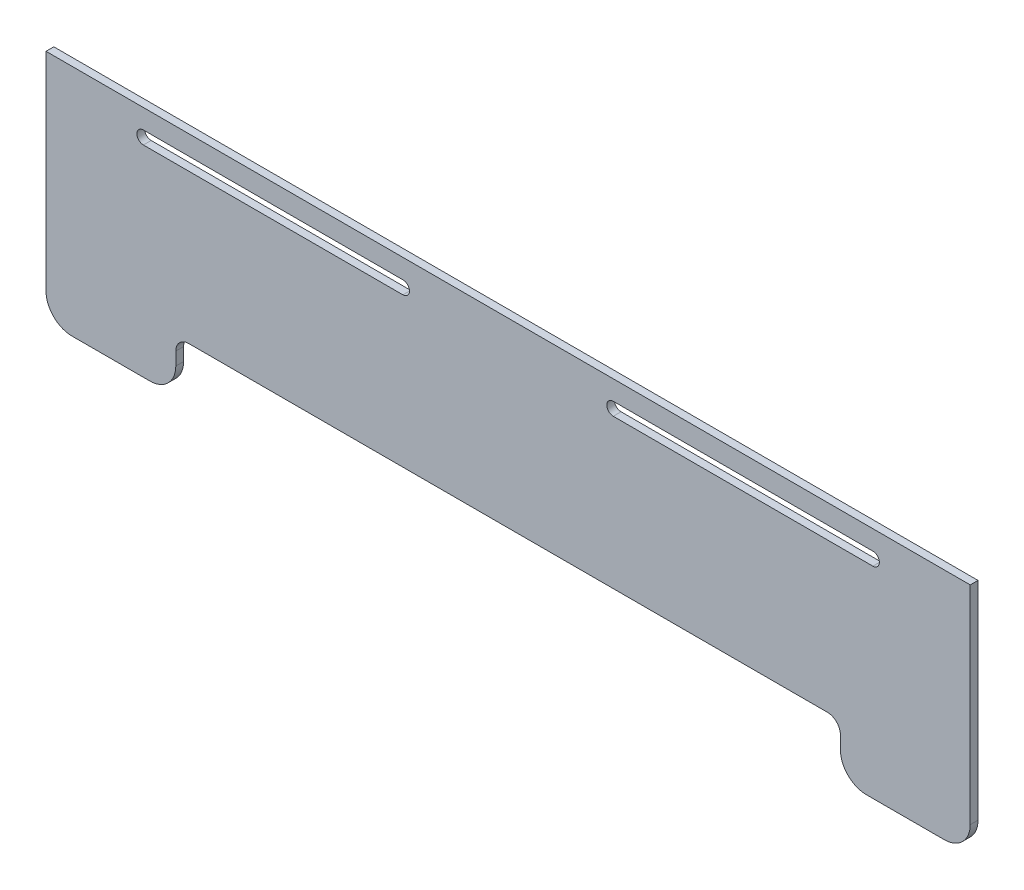
ISO-10303-21;
HEADER;
FILE_DESCRIPTION(('STEP AP214'),'2;1');
FILE_NAME('part.step','',(''),(''),'','','');
FILE_SCHEMA(('AUTOMOTIVE_DESIGN { 1 0 10303 214 1 1 1 1 }'));
ENDSEC;
DATA;
#1=APPLICATION_CONTEXT('core data for automotive mechanical design processes');
#2=APPLICATION_PROTOCOL_DEFINITION('international standard','automotive_design',2000,#1);
#3=PRODUCT_CONTEXT('',#1,'mechanical');
#4=PRODUCT('Part','Part','',(#3));
#5=PRODUCT_RELATED_PRODUCT_CATEGORY('part','',(#4));
#6=PRODUCT_DEFINITION_FORMATION('','',#4);
#7=PRODUCT_DEFINITION_CONTEXT('part definition',#1,'design');
#8=PRODUCT_DEFINITION('design','',#6,#7);
#9=PRODUCT_DEFINITION_SHAPE('','',#8);
#10=(LENGTH_UNIT() NAMED_UNIT(*) SI_UNIT(.MILLI.,.METRE.));
#11=(NAMED_UNIT(*) PLANE_ANGLE_UNIT() SI_UNIT($,.RADIAN.));
#12=(NAMED_UNIT(*) SI_UNIT($,.STERADIAN.) SOLID_ANGLE_UNIT());
#13=UNCERTAINTY_MEASURE_WITH_UNIT(LENGTH_MEASURE(1.E-05),#10,'distance_accuracy_value','');
#14=(GEOMETRIC_REPRESENTATION_CONTEXT(3) GLOBAL_UNCERTAINTY_ASSIGNED_CONTEXT((#13)) GLOBAL_UNIT_ASSIGNED_CONTEXT((#10,
#11,#12)) REPRESENTATION_CONTEXT('',''));
#15=CARTESIAN_POINT('',(0.,0.,0.));
#16=DIRECTION('',(0.,0.,1.));
#17=DIRECTION('',(1.,0.,0.));
#18=AXIS2_PLACEMENT_3D('',#15,#16,#17);
#19=CARTESIAN_POINT('',(-168.,-80.,3.));
#20=DIRECTION('',(0.,0.,-1.));
#21=DIRECTION('',(-1.,0.,0.));
#22=AXIS2_PLACEMENT_3D('',#19,#20,#21);
#23=PLANE('',#22);
#24=CARTESIAN_POINT('',(40.5,-9.99999999999983,3.));
#25=DIRECTION('',(0.,0.,1.));
#26=DIRECTION('',(1.,0.,0.));
#27=AXIS2_PLACEMENT_3D('',#24,#25,#26);
#28=CIRCLE('',#27,2.49999999999999);
#29=CARTESIAN_POINT('',(40.5,-7.50000000000004,3.));
#30=VERTEX_POINT('',#29);
#31=CARTESIAN_POINT('',(40.5,-12.5,3.));
#32=VERTEX_POINT('',#31);
#33=EDGE_CURVE('E218',#30,#32,#28,.T.);
#34=ORIENTED_EDGE('',*,*,#33,.F.);
#35=DIRECTION('',(-1.,0.,0.));
#36=VECTOR('',#35,1.);
#37=CARTESIAN_POINT('',(40.5,-7.50000000000004,3.));
#38=LINE('',#37,#36);
#39=CARTESIAN_POINT('',(140.5,-7.50000000000002,3.));
#40=VERTEX_POINT('',#39);
#41=EDGE_CURVE('E226',#40,#30,#38,.T.);
#42=ORIENTED_EDGE('',*,*,#41,.F.);
#43=CARTESIAN_POINT('',(140.5,-9.99999999999981,3.));
#44=DIRECTION('',(0.,0.,1.));
#45=DIRECTION('',(1.,0.,0.));
#46=AXIS2_PLACEMENT_3D('',#43,#44,#45);
#47=CIRCLE('',#46,2.49999999999999);
#48=CARTESIAN_POINT('',(140.5,-12.4999999999998,3.));
#49=VERTEX_POINT('',#48);
#50=EDGE_CURVE('E223',#49,#40,#47,.T.);
#51=ORIENTED_EDGE('',*,*,#50,.F.);
#52=DIRECTION('',(1.,0.,0.));
#53=VECTOR('',#52,1.);
#54=CARTESIAN_POINT('',(40.5,-12.5,3.));
#55=LINE('',#54,#53);
#56=EDGE_CURVE('E220',#32,#49,#55,.T.);
#57=ORIENTED_EDGE('',*,*,#56,.F.);
#58=EDGE_LOOP('',(#34,#42,#51,#57));
#59=FACE_BOUND('',#58,.T.);
#60=DIRECTION('',(0.,-1.,0.));
#61=VECTOR('',#60,1.);
#62=CARTESIAN_POINT('',(-178.,0.,3.));
#63=LINE('',#62,#61);
#64=CARTESIAN_POINT('',(-178.,0.,3.));
#65=VERTEX_POINT('',#64);
#66=CARTESIAN_POINT('',(-178.,-80.,3.));
#67=VERTEX_POINT('',#66);
#68=EDGE_CURVE('E249',#65,#67,#63,.T.);
#69=ORIENTED_EDGE('',*,*,#68,.T.);
#70=CARTESIAN_POINT('',(-168.,-80.,3.));
#71=DIRECTION('',(0.,0.,1.));
#72=DIRECTION('',(-1.,0.,0.));
#73=AXIS2_PLACEMENT_3D('',#70,#71,#72);
#74=CIRCLE('',#73,9.99999999999999);
#75=CARTESIAN_POINT('',(-168.,-90.,3.));
#76=VERTEX_POINT('',#75);
#77=EDGE_CURVE('E252',#67,#76,#74,.T.);
#78=ORIENTED_EDGE('',*,*,#77,.T.);
#79=DIRECTION('',(1.,0.,0.));
#80=VECTOR('',#79,1.);
#81=CARTESIAN_POINT('',(-168.,-90.,3.));
#82=LINE('',#81,#80);
#83=CARTESIAN_POINT('',(-138.,-90.0000000000001,3.));
#84=VERTEX_POINT('',#83);
#85=EDGE_CURVE('E255',#76,#84,#82,.T.);
#86=ORIENTED_EDGE('',*,*,#85,.T.);
#87=CARTESIAN_POINT('',(-138.,-80.,3.));
#88=DIRECTION('',(0.,0.,1.));
#89=DIRECTION('',(1.,0.,0.));
#90=AXIS2_PLACEMENT_3D('',#87,#88,#89);
#91=CIRCLE('',#90,10.);
#92=CARTESIAN_POINT('',(-128.,-80.,3.));
#93=VERTEX_POINT('',#92);
#94=EDGE_CURVE('E257',#84,#93,#91,.T.);
#95=ORIENTED_EDGE('',*,*,#94,.T.);
#96=DIRECTION('',(0.,1.,0.));
#97=VECTOR('',#96,1.);
#98=CARTESIAN_POINT('',(-128.,-75.,3.));
#99=LINE('',#98,#97);
#100=CARTESIAN_POINT('',(-128.,-75.,3.));
#101=VERTEX_POINT('',#100);
#102=EDGE_CURVE('E259',#93,#101,#99,.T.);
#103=ORIENTED_EDGE('',*,*,#102,.T.);
#104=CARTESIAN_POINT('',(-123.,-75.,3.));
#105=DIRECTION('',(0.,0.,-1.));
#106=DIRECTION('',(-1.,0.,0.));
#107=AXIS2_PLACEMENT_3D('',#104,#105,#106);
#108=CIRCLE('',#107,5.);
#109=CARTESIAN_POINT('',(-123.,-70.,3.));
#110=VERTEX_POINT('',#109);
#111=EDGE_CURVE('E261',#101,#110,#108,.T.);
#112=ORIENTED_EDGE('',*,*,#111,.T.);
#113=DIRECTION('',(1.,0.,0.));
#114=VECTOR('',#113,1.);
#115=CARTESIAN_POINT('',(-123.,-70.,3.));
#116=LINE('',#115,#114);
#117=CARTESIAN_POINT('',(123.,-70.,3.));
#118=VERTEX_POINT('',#117);
#119=EDGE_CURVE('E263',#110,#118,#116,.T.);
#120=ORIENTED_EDGE('',*,*,#119,.T.);
#121=CARTESIAN_POINT('',(123.,-75.,3.));
#122=DIRECTION('',(0.,0.,-1.));
#123=DIRECTION('',(1.,0.,0.));
#124=AXIS2_PLACEMENT_3D('',#121,#122,#123);
#125=CIRCLE('',#124,5.);
#126=CARTESIAN_POINT('',(128.,-75.,3.));
#127=VERTEX_POINT('',#126);
#128=EDGE_CURVE('E265',#118,#127,#125,.T.);
#129=ORIENTED_EDGE('',*,*,#128,.T.);
#130=DIRECTION('',(0.,-1.,0.));
#131=VECTOR('',#130,1.);
#132=CARTESIAN_POINT('',(128.,-75.,3.));
#133=LINE('',#132,#131);
#134=CARTESIAN_POINT('',(128.,-80.,3.));
#135=VERTEX_POINT('',#134);
#136=EDGE_CURVE('E267',#127,#135,#133,.T.);
#137=ORIENTED_EDGE('',*,*,#136,.T.);
#138=CARTESIAN_POINT('',(138.,-80.,3.));
#139=DIRECTION('',(0.,0.,1.));
#140=DIRECTION('',(-1.,0.,0.));
#141=AXIS2_PLACEMENT_3D('',#138,#139,#140);
#142=CIRCLE('',#141,10.);
#143=CARTESIAN_POINT('',(138.,-90.,3.));
#144=VERTEX_POINT('',#143);
#145=EDGE_CURVE('E269',#135,#144,#142,.T.);
#146=ORIENTED_EDGE('',*,*,#145,.T.);
#147=DIRECTION('',(1.,0.,0.));
#148=VECTOR('',#147,1.);
#149=CARTESIAN_POINT('',(168.,-90.,3.));
#150=LINE('',#149,#148);
#151=CARTESIAN_POINT('',(168.,-90.,3.));
#152=VERTEX_POINT('',#151);
#153=EDGE_CURVE('E271',#144,#152,#150,.T.);
#154=ORIENTED_EDGE('',*,*,#153,.T.);
#155=CARTESIAN_POINT('',(168.,-80.,3.));
#156=DIRECTION('',(0.,0.,1.));
#157=DIRECTION('',(-1.,0.,0.));
#158=AXIS2_PLACEMENT_3D('',#155,#156,#157);
#159=CIRCLE('',#158,10.);
#160=CARTESIAN_POINT('',(178.,-80.,3.));
#161=VERTEX_POINT('',#160);
#162=EDGE_CURVE('E273',#152,#161,#159,.T.);
#163=ORIENTED_EDGE('',*,*,#162,.T.);
#164=DIRECTION('',(0.,1.,0.));
#165=VECTOR('',#164,1.);
#166=CARTESIAN_POINT('',(178.,0.,3.));
#167=LINE('',#166,#165);
#168=CARTESIAN_POINT('',(178.,0.,3.));
#169=VERTEX_POINT('',#168);
#170=EDGE_CURVE('E275',#161,#169,#167,.T.);
#171=ORIENTED_EDGE('',*,*,#170,.T.);
#172=DIRECTION('',(-1.,0.,0.));
#173=VECTOR('',#172,1.);
#174=CARTESIAN_POINT('',(-178.,0.,3.));
#175=LINE('',#174,#173);
#176=EDGE_CURVE('E277',#169,#65,#175,.T.);
#177=ORIENTED_EDGE('',*,*,#176,.T.);
#178=EDGE_LOOP('',(#69,#78,#86,#95,#103,#112,#120,#129,#137,#146,#154,#163,#171,#177));
#179=FACE_BOUND('',#178,.T.);
#180=CARTESIAN_POINT('',(-40.5,-10.,3.));
#181=DIRECTION('',(0.,0.,1.));
#182=DIRECTION('',(-1.,0.,0.));
#183=AXIS2_PLACEMENT_3D('',#180,#181,#182);
#184=CIRCLE('',#183,2.49999999999999);
#185=CARTESIAN_POINT('',(-40.5,-12.5,3.));
#186=VERTEX_POINT('',#185);
#187=CARTESIAN_POINT('',(-40.5,-7.50000000000004,3.));
#188=VERTEX_POINT('',#187);
#189=EDGE_CURVE('E182',#186,#188,#184,.T.);
#190=ORIENTED_EDGE('',*,*,#189,.F.);
#191=DIRECTION('',(1.,0.,0.));
#192=VECTOR('',#191,1.);
#193=CARTESIAN_POINT('',(-40.5,-12.5,3.));
#194=LINE('',#193,#192);
#195=CARTESIAN_POINT('',(-140.5,-12.5,3.));
#196=VERTEX_POINT('',#195);
#197=EDGE_CURVE('E204',#196,#186,#194,.T.);
#198=ORIENTED_EDGE('',*,*,#197,.F.);
#199=CARTESIAN_POINT('',(-140.5,-9.99999999999981,3.));
#200=DIRECTION('',(0.,0.,1.));
#201=DIRECTION('',(-1.,0.,0.));
#202=AXIS2_PLACEMENT_3D('',#199,#200,#201);
#203=CIRCLE('',#202,2.49999999999999);
#204=CARTESIAN_POINT('',(-140.5,-7.50000000000002,3.));
#205=VERTEX_POINT('',#204);
#206=EDGE_CURVE('E202',#205,#196,#203,.T.);
#207=ORIENTED_EDGE('',*,*,#206,.F.);
#208=DIRECTION('',(-1.,0.,0.));
#209=VECTOR('',#208,1.);
#210=CARTESIAN_POINT('',(-40.5,-7.50000000000004,3.));
#211=LINE('',#210,#209);
#212=EDGE_CURVE('E190',#188,#205,#211,.T.);
#213=ORIENTED_EDGE('',*,*,#212,.F.);
#214=EDGE_LOOP('',(#190,#198,#207,#213));
#215=FACE_BOUND('',#214,.T.);
#216=ADVANCED_FACE('F33',(#59,#179,#215),#23,.F.);
#217=CARTESIAN_POINT('',(-168.,-80.,0.));
#218=DIRECTION('',(0.,0.,-1.));
#219=DIRECTION('',(-1.,0.,0.));
#220=AXIS2_PLACEMENT_3D('',#217,#218,#219);
#221=PLANE('',#220);
#222=DIRECTION('',(0.,-1.,0.));
#223=VECTOR('',#222,1.);
#224=CARTESIAN_POINT('',(-178.,0.,0.));
#225=LINE('',#224,#223);
#226=CARTESIAN_POINT('',(-178.,0.,0.));
#227=VERTEX_POINT('',#226);
#228=CARTESIAN_POINT('',(-178.,-80.,0.));
#229=VERTEX_POINT('',#228);
#230=EDGE_CURVE('E248',#227,#229,#225,.T.);
#231=ORIENTED_EDGE('',*,*,#230,.F.);
#232=DIRECTION('',(-1.,0.,0.));
#233=VECTOR('',#232,1.);
#234=CARTESIAN_POINT('',(-178.,0.,0.));
#235=LINE('',#234,#233);
#236=CARTESIAN_POINT('',(178.,0.,0.));
#237=VERTEX_POINT('',#236);
#238=EDGE_CURVE('E253',#237,#227,#235,.T.);
#239=ORIENTED_EDGE('',*,*,#238,.F.);
#240=DIRECTION('',(0.,1.,0.));
#241=VECTOR('',#240,1.);
#242=CARTESIAN_POINT('',(178.,0.,0.));
#243=LINE('',#242,#241);
#244=CARTESIAN_POINT('',(178.,-80.,0.));
#245=VERTEX_POINT('',#244);
#246=EDGE_CURVE('E304',#245,#237,#243,.T.);
#247=ORIENTED_EDGE('',*,*,#246,.F.);
#248=CARTESIAN_POINT('',(168.,-80.,0.));
#249=DIRECTION('',(0.,0.,1.));
#250=DIRECTION('',(-1.,0.,0.));
#251=AXIS2_PLACEMENT_3D('',#248,#249,#250);
#252=CIRCLE('',#251,10.);
#253=CARTESIAN_POINT('',(168.,-90.,0.));
#254=VERTEX_POINT('',#253);
#255=EDGE_CURVE('E302',#254,#245,#252,.T.);
#256=ORIENTED_EDGE('',*,*,#255,.F.);
#257=DIRECTION('',(1.,0.,0.));
#258=VECTOR('',#257,1.);
#259=CARTESIAN_POINT('',(168.,-90.,0.));
#260=LINE('',#259,#258);
#261=CARTESIAN_POINT('',(138.,-90.,0.));
#262=VERTEX_POINT('',#261);
#263=EDGE_CURVE('E300',#262,#254,#260,.T.);
#264=ORIENTED_EDGE('',*,*,#263,.F.);
#265=CARTESIAN_POINT('',(138.,-80.,0.));
#266=DIRECTION('',(0.,0.,1.));
#267=DIRECTION('',(-1.,0.,0.));
#268=AXIS2_PLACEMENT_3D('',#265,#266,#267);
#269=CIRCLE('',#268,10.);
#270=CARTESIAN_POINT('',(128.,-80.,0.));
#271=VERTEX_POINT('',#270);
#272=EDGE_CURVE('E298',#271,#262,#269,.T.);
#273=ORIENTED_EDGE('',*,*,#272,.F.);
#274=DIRECTION('',(0.,-1.,0.));
#275=VECTOR('',#274,1.);
#276=CARTESIAN_POINT('',(128.,-75.,0.));
#277=LINE('',#276,#275);
#278=CARTESIAN_POINT('',(128.,-75.,0.));
#279=VERTEX_POINT('',#278);
#280=EDGE_CURVE('E296',#279,#271,#277,.T.);
#281=ORIENTED_EDGE('',*,*,#280,.F.);
#282=CARTESIAN_POINT('',(123.,-75.,0.));
#283=DIRECTION('',(0.,0.,-1.));
#284=DIRECTION('',(1.,0.,0.));
#285=AXIS2_PLACEMENT_3D('',#282,#283,#284);
#286=CIRCLE('',#285,5.);
#287=CARTESIAN_POINT('',(123.,-70.,0.));
#288=VERTEX_POINT('',#287);
#289=EDGE_CURVE('E294',#288,#279,#286,.T.);
#290=ORIENTED_EDGE('',*,*,#289,.F.);
#291=DIRECTION('',(1.,0.,0.));
#292=VECTOR('',#291,1.);
#293=CARTESIAN_POINT('',(-123.,-70.,0.));
#294=LINE('',#293,#292);
#295=CARTESIAN_POINT('',(-123.,-70.,0.));
#296=VERTEX_POINT('',#295);
#297=EDGE_CURVE('E292',#296,#288,#294,.T.);
#298=ORIENTED_EDGE('',*,*,#297,.F.);
#299=CARTESIAN_POINT('',(-123.,-75.,0.));
#300=DIRECTION('',(0.,0.,-1.));
#301=DIRECTION('',(-1.,0.,0.));
#302=AXIS2_PLACEMENT_3D('',#299,#300,#301);
#303=CIRCLE('',#302,5.);
#304=CARTESIAN_POINT('',(-128.,-75.,0.));
#305=VERTEX_POINT('',#304);
#306=EDGE_CURVE('E290',#305,#296,#303,.T.);
#307=ORIENTED_EDGE('',*,*,#306,.F.);
#308=DIRECTION('',(0.,1.,0.));
#309=VECTOR('',#308,1.);
#310=CARTESIAN_POINT('',(-128.,-75.,0.));
#311=LINE('',#310,#309);
#312=CARTESIAN_POINT('',(-128.,-80.,0.));
#313=VERTEX_POINT('',#312);
#314=EDGE_CURVE('E288',#313,#305,#311,.T.);
#315=ORIENTED_EDGE('',*,*,#314,.F.);
#316=CARTESIAN_POINT('',(-138.,-80.,0.));
#317=DIRECTION('',(0.,0.,1.));
#318=DIRECTION('',(1.,0.,0.));
#319=AXIS2_PLACEMENT_3D('',#316,#317,#318);
#320=CIRCLE('',#319,10.);
#321=CARTESIAN_POINT('',(-138.,-90.0000000000001,0.));
#322=VERTEX_POINT('',#321);
#323=EDGE_CURVE('E286',#322,#313,#320,.T.);
#324=ORIENTED_EDGE('',*,*,#323,.F.);
#325=DIRECTION('',(1.,0.,0.));
#326=VECTOR('',#325,1.);
#327=CARTESIAN_POINT('',(-168.,-90.,0.));
#328=LINE('',#327,#326);
#329=CARTESIAN_POINT('',(-168.,-90.,0.));
#330=VERTEX_POINT('',#329);
#331=EDGE_CURVE('E284',#330,#322,#328,.T.);
#332=ORIENTED_EDGE('',*,*,#331,.F.);
#333=CARTESIAN_POINT('',(-168.,-80.,0.));
#334=DIRECTION('',(0.,0.,1.));
#335=DIRECTION('',(-1.,0.,0.));
#336=AXIS2_PLACEMENT_3D('',#333,#334,#335);
#337=CIRCLE('',#336,9.99999999999999);
#338=EDGE_CURVE('E282',#229,#330,#337,.T.);
#339=ORIENTED_EDGE('',*,*,#338,.F.);
#340=EDGE_LOOP('',(#231,#239,#247,#256,#264,#273,#281,#290,#298,#307,#315,#324,#332,#339));
#341=FACE_BOUND('',#340,.T.);
#342=DIRECTION('',(-1.,0.,0.));
#343=VECTOR('',#342,1.);
#344=CARTESIAN_POINT('',(40.5,-7.50000000000004,0.));
#345=LINE('',#344,#343);
#346=CARTESIAN_POINT('',(140.5,-7.50000000000002,0.));
#347=VERTEX_POINT('',#346);
#348=CARTESIAN_POINT('',(40.5,-7.50000000000004,0.));
#349=VERTEX_POINT('',#348);
#350=EDGE_CURVE('E221',#347,#349,#345,.T.);
#351=ORIENTED_EDGE('',*,*,#350,.T.);
#352=CARTESIAN_POINT('',(40.5,-9.99999999999983,0.));
#353=DIRECTION('',(0.,0.,1.));
#354=DIRECTION('',(1.,0.,0.));
#355=AXIS2_PLACEMENT_3D('',#352,#353,#354);
#356=CIRCLE('',#355,2.49999999999999);
#357=CARTESIAN_POINT('',(40.5,-12.5,0.));
#358=VERTEX_POINT('',#357);
#359=EDGE_CURVE('E198',#349,#358,#356,.T.);
#360=ORIENTED_EDGE('',*,*,#359,.T.);
#361=DIRECTION('',(1.,0.,0.));
#362=VECTOR('',#361,1.);
#363=CARTESIAN_POINT('',(40.5,-12.5,0.));
#364=LINE('',#363,#362);
#365=CARTESIAN_POINT('',(140.5,-12.4999999999998,0.));
#366=VERTEX_POINT('',#365);
#367=EDGE_CURVE('E231',#358,#366,#364,.T.);
#368=ORIENTED_EDGE('',*,*,#367,.T.);
#369=CARTESIAN_POINT('',(140.5,-9.99999999999981,0.));
#370=DIRECTION('',(0.,0.,1.));
#371=DIRECTION('',(1.,0.,0.));
#372=AXIS2_PLACEMENT_3D('',#369,#370,#371);
#373=CIRCLE('',#372,2.49999999999999);
#374=EDGE_CURVE('E234',#366,#347,#373,.T.);
#375=ORIENTED_EDGE('',*,*,#374,.T.);
#376=EDGE_LOOP('',(#351,#360,#368,#375));
#377=FACE_BOUND('',#376,.T.);
#378=DIRECTION('',(1.,0.,0.));
#379=VECTOR('',#378,1.);
#380=CARTESIAN_POINT('',(-40.5,-12.5,0.));
#381=LINE('',#380,#379);
#382=CARTESIAN_POINT('',(-140.5,-12.4999999999998,0.));
#383=VERTEX_POINT('',#382);
#384=CARTESIAN_POINT('',(-40.5,-12.5,0.));
#385=VERTEX_POINT('',#384);
#386=EDGE_CURVE('E191',#383,#385,#381,.T.);
#387=ORIENTED_EDGE('',*,*,#386,.T.);
#388=CARTESIAN_POINT('',(-40.5,-10.,0.));
#389=DIRECTION('',(0.,0.,1.));
#390=DIRECTION('',(-1.,0.,0.));
#391=AXIS2_PLACEMENT_3D('',#388,#389,#390);
#392=CIRCLE('',#391,2.49999999999999);
#393=CARTESIAN_POINT('',(-40.5,-7.50000000000004,0.));
#394=VERTEX_POINT('',#393);
#395=EDGE_CURVE('E56',#385,#394,#392,.T.);
#396=ORIENTED_EDGE('',*,*,#395,.T.);
#397=DIRECTION('',(-1.,0.,0.));
#398=VECTOR('',#397,1.);
#399=CARTESIAN_POINT('',(-40.5,-7.50000000000004,0.));
#400=LINE('',#399,#398);
#401=CARTESIAN_POINT('',(-140.5,-7.50000000000002,0.));
#402=VERTEX_POINT('',#401);
#403=EDGE_CURVE('E197',#394,#402,#400,.T.);
#404=ORIENTED_EDGE('',*,*,#403,.T.);
#405=CARTESIAN_POINT('',(-140.5,-9.99999999999981,0.));
#406=DIRECTION('',(0.,0.,1.));
#407=DIRECTION('',(-1.,0.,0.));
#408=AXIS2_PLACEMENT_3D('',#405,#406,#407);
#409=CIRCLE('',#408,2.49999999999999);
#410=EDGE_CURVE('E210',#402,#383,#409,.T.);
#411=ORIENTED_EDGE('',*,*,#410,.T.);
#412=EDGE_LOOP('',(#387,#396,#404,#411));
#413=FACE_BOUND('',#412,.T.);
#414=ADVANCED_FACE('F352',(#341,#377,#413),#221,.T.);
#415=CARTESIAN_POINT('',(-178.,0.,3.));
#416=DIRECTION('',(1.,0.,0.));
#417=DIRECTION('',(0.,0.,-1.));
#418=AXIS2_PLACEMENT_3D('',#415,#416,#417);
#419=PLANE('',#418);
#420=ORIENTED_EDGE('',*,*,#230,.T.);
#421=DIRECTION('',(0.,0.,-1.));
#422=VECTOR('',#421,1.);
#423=CARTESIAN_POINT('',(-178.,-80.,3.));
#424=LINE('',#423,#422);
#425=EDGE_CURVE('E11',#67,#229,#424,.T.);
#426=ORIENTED_EDGE('',*,*,#425,.F.);
#427=ORIENTED_EDGE('',*,*,#68,.F.);
#428=DIRECTION('',(0.,0.,-1.));
#429=VECTOR('',#428,1.);
#430=CARTESIAN_POINT('',(-178.,0.,3.));
#431=LINE('',#430,#429);
#432=EDGE_CURVE('E279',#65,#227,#431,.T.);
#433=ORIENTED_EDGE('',*,*,#432,.T.);
#434=EDGE_LOOP('',(#420,#426,#427,#433));
#435=FACE_BOUND('',#434,.T.);
#436=ADVANCED_FACE('F35',(#435),#419,.F.);
#437=CARTESIAN_POINT('',(-168.,-80.,3.));
#438=DIRECTION('',(0.,0.,-1.));
#439=DIRECTION('',(-1.,0.,0.));
#440=AXIS2_PLACEMENT_3D('',#437,#438,#439);
#441=CYLINDRICAL_SURFACE('',#440,9.99999999999999);
#442=ORIENTED_EDGE('',*,*,#338,.T.);
#443=DIRECTION('',(0.,0.,-1.));
#444=VECTOR('',#443,1.);
#445=CARTESIAN_POINT('',(-168.,-90.,3.));
#446=LINE('',#445,#444);
#447=EDGE_CURVE('E41',#76,#330,#446,.T.);
#448=ORIENTED_EDGE('',*,*,#447,.F.);
#449=ORIENTED_EDGE('',*,*,#77,.F.);
#450=ORIENTED_EDGE('',*,*,#425,.T.);
#451=EDGE_LOOP('',(#442,#448,#449,#450));
#452=FACE_BOUND('',#451,.T.);
#453=ADVANCED_FACE('F369',(#452),#441,.T.);
#454=CARTESIAN_POINT('',(-168.,-90.,3.));
#455=DIRECTION('',(0.,1.,0.));
#456=DIRECTION('',(-1.,0.,0.));
#457=AXIS2_PLACEMENT_3D('',#454,#455,#456);
#458=PLANE('',#457);
#459=ORIENTED_EDGE('',*,*,#331,.T.);
#460=DIRECTION('',(0.,0.,-1.));
#461=VECTOR('',#460,1.);
#462=CARTESIAN_POINT('',(-138.,-90.0000000000001,3.));
#463=LINE('',#462,#461);
#464=EDGE_CURVE('E339',#84,#322,#463,.T.);
#465=ORIENTED_EDGE('',*,*,#464,.F.);
#466=ORIENTED_EDGE('',*,*,#85,.F.);
#467=ORIENTED_EDGE('',*,*,#447,.T.);
#468=EDGE_LOOP('',(#459,#465,#466,#467));
#469=FACE_BOUND('',#468,.T.);
#470=ADVANCED_FACE('F346',(#469),#458,.F.);
#471=CARTESIAN_POINT('',(-138.,-80.,3.));
#472=DIRECTION('',(0.,0.,-1.));
#473=DIRECTION('',(-1.,0.,0.));
#474=AXIS2_PLACEMENT_3D('',#471,#472,#473);
#475=CYLINDRICAL_SURFACE('',#474,10.);
#476=ORIENTED_EDGE('',*,*,#323,.T.);
#477=DIRECTION('',(0.,0.,-1.));
#478=VECTOR('',#477,1.);
#479=CARTESIAN_POINT('',(-128.,-80.,3.));
#480=LINE('',#479,#478);
#481=EDGE_CURVE('E336',#93,#313,#480,.T.);
#482=ORIENTED_EDGE('',*,*,#481,.F.);
#483=ORIENTED_EDGE('',*,*,#94,.F.);
#484=ORIENTED_EDGE('',*,*,#464,.T.);
#485=EDGE_LOOP('',(#476,#482,#483,#484));
#486=FACE_BOUND('',#485,.T.);
#487=ADVANCED_FACE('F358',(#486),#475,.T.);
#488=CARTESIAN_POINT('',(-128.,-75.,3.));
#489=DIRECTION('',(-1.,0.,0.));
#490=DIRECTION('',(0.,0.,1.));
#491=AXIS2_PLACEMENT_3D('',#488,#489,#490);
#492=PLANE('',#491);
#493=ORIENTED_EDGE('',*,*,#314,.T.);
#494=DIRECTION('',(0.,0.,-1.));
#495=VECTOR('',#494,1.);
#496=CARTESIAN_POINT('',(-128.,-75.,3.));
#497=LINE('',#496,#495);
#498=EDGE_CURVE('E333',#101,#305,#497,.T.);
#499=ORIENTED_EDGE('',*,*,#498,.F.);
#500=ORIENTED_EDGE('',*,*,#102,.F.);
#501=ORIENTED_EDGE('',*,*,#481,.T.);
#502=EDGE_LOOP('',(#493,#499,#500,#501));
#503=FACE_BOUND('',#502,.T.);
#504=ADVANCED_FACE('F362',(#503),#492,.F.);
#505=CARTESIAN_POINT('',(-123.,-75.,3.));
#506=DIRECTION('',(0.,0.,-1.));
#507=DIRECTION('',(-1.,0.,0.));
#508=AXIS2_PLACEMENT_3D('',#505,#506,#507);
#509=CYLINDRICAL_SURFACE('',#508,5.);
#510=ORIENTED_EDGE('',*,*,#306,.T.);
#511=DIRECTION('',(0.,0.,-1.));
#512=VECTOR('',#511,1.);
#513=CARTESIAN_POINT('',(-123.,-70.,3.));
#514=LINE('',#513,#512);
#515=EDGE_CURVE('E330',#110,#296,#514,.T.);
#516=ORIENTED_EDGE('',*,*,#515,.F.);
#517=ORIENTED_EDGE('',*,*,#111,.F.);
#518=ORIENTED_EDGE('',*,*,#498,.T.);
#519=EDGE_LOOP('',(#510,#516,#517,#518));
#520=FACE_BOUND('',#519,.T.);
#521=ADVANCED_FACE('F412',(#520),#509,.F.);
#522=CARTESIAN_POINT('',(-123.,-70.,3.));
#523=DIRECTION('',(0.,1.,0.));
#524=DIRECTION('',(0.,0.,1.));
#525=AXIS2_PLACEMENT_3D('',#522,#523,#524);
#526=PLANE('',#525);
#527=ORIENTED_EDGE('',*,*,#297,.T.);
#528=DIRECTION('',(0.,0.,-1.));
#529=VECTOR('',#528,1.);
#530=CARTESIAN_POINT('',(123.,-70.,3.));
#531=LINE('',#530,#529);
#532=EDGE_CURVE('E327',#118,#288,#531,.T.);
#533=ORIENTED_EDGE('',*,*,#532,.F.);
#534=ORIENTED_EDGE('',*,*,#119,.F.);
#535=ORIENTED_EDGE('',*,*,#515,.T.);
#536=EDGE_LOOP('',(#527,#533,#534,#535));
#537=FACE_BOUND('',#536,.T.);
#538=ADVANCED_FACE('F410',(#537),#526,.F.);
#539=CARTESIAN_POINT('',(123.,-75.,3.));
#540=DIRECTION('',(0.,0.,-1.));
#541=DIRECTION('',(-1.,0.,0.));
#542=AXIS2_PLACEMENT_3D('',#539,#540,#541);
#543=CYLINDRICAL_SURFACE('',#542,5.);
#544=ORIENTED_EDGE('',*,*,#289,.T.);
#545=DIRECTION('',(0.,0.,-1.));
#546=VECTOR('',#545,1.);
#547=CARTESIAN_POINT('',(128.,-75.,3.));
#548=LINE('',#547,#546);
#549=EDGE_CURVE('E324',#127,#279,#548,.T.);
#550=ORIENTED_EDGE('',*,*,#549,.F.);
#551=ORIENTED_EDGE('',*,*,#128,.F.);
#552=ORIENTED_EDGE('',*,*,#532,.T.);
#553=EDGE_LOOP('',(#544,#550,#551,#552));
#554=FACE_BOUND('',#553,.T.);
#555=ADVANCED_FACE('F405',(#554),#543,.F.);
#556=CARTESIAN_POINT('',(128.,-75.,3.));
#557=DIRECTION('',(1.,0.,0.));
#558=DIRECTION('',(0.,0.,-1.));
#559=AXIS2_PLACEMENT_3D('',#556,#557,#558);
#560=PLANE('',#559);
#561=ORIENTED_EDGE('',*,*,#280,.T.);
#562=DIRECTION('',(0.,0.,-1.));
#563=VECTOR('',#562,1.);
#564=CARTESIAN_POINT('',(128.,-80.,3.));
#565=LINE('',#564,#563);
#566=EDGE_CURVE('E321',#135,#271,#565,.T.);
#567=ORIENTED_EDGE('',*,*,#566,.F.);
#568=ORIENTED_EDGE('',*,*,#136,.F.);
#569=ORIENTED_EDGE('',*,*,#549,.T.);
#570=EDGE_LOOP('',(#561,#567,#568,#569));
#571=FACE_BOUND('',#570,.T.);
#572=ADVANCED_FACE('F400',(#571),#560,.F.);
#573=CARTESIAN_POINT('',(138.,-80.,3.));
#574=DIRECTION('',(0.,0.,-1.));
#575=DIRECTION('',(-1.,0.,0.));
#576=AXIS2_PLACEMENT_3D('',#573,#574,#575);
#577=CYLINDRICAL_SURFACE('',#576,10.);
#578=ORIENTED_EDGE('',*,*,#272,.T.);
#579=DIRECTION('',(0.,0.,-1.));
#580=VECTOR('',#579,1.);
#581=CARTESIAN_POINT('',(138.,-90.,3.));
#582=LINE('',#581,#580);
#583=EDGE_CURVE('E318',#144,#262,#582,.T.);
#584=ORIENTED_EDGE('',*,*,#583,.F.);
#585=ORIENTED_EDGE('',*,*,#145,.F.);
#586=ORIENTED_EDGE('',*,*,#566,.T.);
#587=EDGE_LOOP('',(#578,#584,#585,#586));
#588=FACE_BOUND('',#587,.T.);
#589=ADVANCED_FACE('F396',(#588),#577,.T.);
#590=CARTESIAN_POINT('',(168.,-90.,3.));
#591=DIRECTION('',(0.,1.,0.));
#592=DIRECTION('',(0.,0.,1.));
#593=AXIS2_PLACEMENT_3D('',#590,#591,#592);
#594=PLANE('',#593);
#595=ORIENTED_EDGE('',*,*,#263,.T.);
#596=DIRECTION('',(0.,0.,-1.));
#597=VECTOR('',#596,1.);
#598=CARTESIAN_POINT('',(168.,-90.,3.));
#599=LINE('',#598,#597);
#600=EDGE_CURVE('E315',#152,#254,#599,.T.);
#601=ORIENTED_EDGE('',*,*,#600,.F.);
#602=ORIENTED_EDGE('',*,*,#153,.F.);
#603=ORIENTED_EDGE('',*,*,#583,.T.);
#604=EDGE_LOOP('',(#595,#601,#602,#603));
#605=FACE_BOUND('',#604,.T.);
#606=ADVANCED_FACE('F391',(#605),#594,.F.);
#607=CARTESIAN_POINT('',(168.,-80.,3.));
#608=DIRECTION('',(0.,0.,-1.));
#609=DIRECTION('',(-1.,0.,0.));
#610=AXIS2_PLACEMENT_3D('',#607,#608,#609);
#611=CYLINDRICAL_SURFACE('',#610,10.);
#612=ORIENTED_EDGE('',*,*,#255,.T.);
#613=DIRECTION('',(0.,0.,-1.));
#614=VECTOR('',#613,1.);
#615=CARTESIAN_POINT('',(178.,-80.,3.));
#616=LINE('',#615,#614);
#617=EDGE_CURVE('E312',#161,#245,#616,.T.);
#618=ORIENTED_EDGE('',*,*,#617,.F.);
#619=ORIENTED_EDGE('',*,*,#162,.F.);
#620=ORIENTED_EDGE('',*,*,#600,.T.);
#621=EDGE_LOOP('',(#612,#618,#619,#620));
#622=FACE_BOUND('',#621,.T.);
#623=ADVANCED_FACE('F385',(#622),#611,.T.);
#624=CARTESIAN_POINT('',(178.,0.,3.));
#625=DIRECTION('',(-1.,0.,0.));
#626=DIRECTION('',(0.,-1.,0.));
#627=AXIS2_PLACEMENT_3D('',#624,#625,#626);
#628=PLANE('',#627);
#629=ORIENTED_EDGE('',*,*,#246,.T.);
#630=DIRECTION('',(0.,0.,-1.));
#631=VECTOR('',#630,1.);
#632=CARTESIAN_POINT('',(178.,0.,3.));
#633=LINE('',#632,#631);
#634=EDGE_CURVE('E309',#169,#237,#633,.T.);
#635=ORIENTED_EDGE('',*,*,#634,.F.);
#636=ORIENTED_EDGE('',*,*,#170,.F.);
#637=ORIENTED_EDGE('',*,*,#617,.T.);
#638=EDGE_LOOP('',(#629,#635,#636,#637));
#639=FACE_BOUND('',#638,.T.);
#640=ADVANCED_FACE('F381',(#639),#628,.F.);
#641=CARTESIAN_POINT('',(-178.,0.,3.));
#642=DIRECTION('',(0.,-1.,0.));
#643=DIRECTION('',(1.,0.,0.));
#644=AXIS2_PLACEMENT_3D('',#641,#642,#643);
#645=PLANE('',#644);
#646=ORIENTED_EDGE('',*,*,#238,.T.);
#647=ORIENTED_EDGE('',*,*,#432,.F.);
#648=ORIENTED_EDGE('',*,*,#176,.F.);
#649=ORIENTED_EDGE('',*,*,#634,.T.);
#650=EDGE_LOOP('',(#646,#647,#648,#649));
#651=FACE_BOUND('',#650,.T.);
#652=ADVANCED_FACE('F376',(#651),#645,.F.);
#653=CARTESIAN_POINT('',(40.5,-9.99999999999983,3.));
#654=DIRECTION('',(0.,0.,-1.));
#655=DIRECTION('',(-1.,0.,0.));
#656=AXIS2_PLACEMENT_3D('',#653,#654,#655);
#657=CYLINDRICAL_SURFACE('',#656,2.49999999999999);
#658=ORIENTED_EDGE('',*,*,#359,.F.);
#659=DIRECTION('',(0.,0.,-1.));
#660=VECTOR('',#659,1.);
#661=CARTESIAN_POINT('',(40.5,-7.50000000000004,3.));
#662=LINE('',#661,#660);
#663=EDGE_CURVE('E228',#30,#349,#662,.T.);
#664=ORIENTED_EDGE('',*,*,#663,.F.);
#665=ORIENTED_EDGE('',*,*,#33,.T.);
#666=DIRECTION('',(0.,0.,-1.));
#667=VECTOR('',#666,1.);
#668=CARTESIAN_POINT('',(40.5,-12.5,3.));
#669=LINE('',#668,#667);
#670=EDGE_CURVE('E245',#32,#358,#669,.T.);
#671=ORIENTED_EDGE('',*,*,#670,.T.);
#672=EDGE_LOOP('',(#658,#664,#665,#671));
#673=FACE_BOUND('',#672,.T.);
#674=ADVANCED_FACE('F430',(#673),#657,.F.);
#675=CARTESIAN_POINT('',(40.5,-12.5,3.));
#676=DIRECTION('',(0.,1.,0.));
#677=DIRECTION('',(-1.,0.,0.));
#678=AXIS2_PLACEMENT_3D('',#675,#676,#677);
#679=PLANE('',#678);
#680=ORIENTED_EDGE('',*,*,#367,.F.);
#681=ORIENTED_EDGE('',*,*,#670,.F.);
#682=ORIENTED_EDGE('',*,*,#56,.T.);
#683=DIRECTION('',(0.,0.,-1.));
#684=VECTOR('',#683,1.);
#685=CARTESIAN_POINT('',(140.5,-12.4999999999998,3.));
#686=LINE('',#685,#684);
#687=EDGE_CURVE('E243',#49,#366,#686,.T.);
#688=ORIENTED_EDGE('',*,*,#687,.T.);
#689=EDGE_LOOP('',(#680,#681,#682,#688));
#690=FACE_BOUND('',#689,.T.);
#691=ADVANCED_FACE('F480',(#690),#679,.T.);
#692=CARTESIAN_POINT('',(140.5,-9.99999999999981,3.));
#693=DIRECTION('',(0.,0.,-1.));
#694=DIRECTION('',(-1.,0.,0.));
#695=AXIS2_PLACEMENT_3D('',#692,#693,#694);
#696=CYLINDRICAL_SURFACE('',#695,2.49999999999999);
#697=ORIENTED_EDGE('',*,*,#374,.F.);
#698=ORIENTED_EDGE('',*,*,#687,.F.);
#699=ORIENTED_EDGE('',*,*,#50,.T.);
#700=DIRECTION('',(0.,0.,-1.));
#701=VECTOR('',#700,1.);
#702=CARTESIAN_POINT('',(140.5,-7.50000000000002,3.));
#703=LINE('',#702,#701);
#704=EDGE_CURVE('E241',#40,#347,#703,.T.);
#705=ORIENTED_EDGE('',*,*,#704,.T.);
#706=EDGE_LOOP('',(#697,#698,#699,#705));
#707=FACE_BOUND('',#706,.T.);
#708=ADVANCED_FACE('F487',(#707),#696,.F.);
#709=CARTESIAN_POINT('',(40.5,-7.50000000000004,3.));
#710=DIRECTION('',(0.,-1.,0.));
#711=DIRECTION('',(1.,0.,0.));
#712=AXIS2_PLACEMENT_3D('',#709,#710,#711);
#713=PLANE('',#712);
#714=ORIENTED_EDGE('',*,*,#350,.F.);
#715=ORIENTED_EDGE('',*,*,#704,.F.);
#716=ORIENTED_EDGE('',*,*,#41,.T.);
#717=ORIENTED_EDGE('',*,*,#663,.T.);
#718=EDGE_LOOP('',(#714,#715,#716,#717));
#719=FACE_BOUND('',#718,.T.);
#720=ADVANCED_FACE('F494',(#719),#713,.T.);
#721=CARTESIAN_POINT('',(-40.5,-10.,3.));
#722=DIRECTION('',(0.,0.,-1.));
#723=DIRECTION('',(-1.,0.,0.));
#724=AXIS2_PLACEMENT_3D('',#721,#722,#723);
#725=CYLINDRICAL_SURFACE('',#724,2.49999999999999);
#726=ORIENTED_EDGE('',*,*,#395,.F.);
#727=DIRECTION('',(0.,0.,-1.));
#728=VECTOR('',#727,1.);
#729=CARTESIAN_POINT('',(-40.5,-12.5,3.));
#730=LINE('',#729,#728);
#731=EDGE_CURVE('E186',#186,#385,#730,.T.);
#732=ORIENTED_EDGE('',*,*,#731,.F.);
#733=ORIENTED_EDGE('',*,*,#189,.T.);
#734=DIRECTION('',(0.,0.,-1.));
#735=VECTOR('',#734,1.);
#736=CARTESIAN_POINT('',(-40.5,-7.50000000000004,3.));
#737=LINE('',#736,#735);
#738=EDGE_CURVE('E185',#188,#394,#737,.T.);
#739=ORIENTED_EDGE('',*,*,#738,.T.);
#740=EDGE_LOOP('',(#726,#732,#733,#739));
#741=FACE_BOUND('',#740,.T.);
#742=ADVANCED_FACE('F184',(#741),#725,.F.);
#743=CARTESIAN_POINT('',(-40.5,-7.50000000000004,3.));
#744=DIRECTION('',(0.,-1.,0.));
#745=DIRECTION('',(1.,0.,0.));
#746=AXIS2_PLACEMENT_3D('',#743,#744,#745);
#747=PLANE('',#746);
#748=ORIENTED_EDGE('',*,*,#403,.F.);
#749=ORIENTED_EDGE('',*,*,#738,.F.);
#750=ORIENTED_EDGE('',*,*,#212,.T.);
#751=DIRECTION('',(0.,0.,-1.));
#752=VECTOR('',#751,1.);
#753=CARTESIAN_POINT('',(-140.5,-7.50000000000002,3.));
#754=LINE('',#753,#752);
#755=EDGE_CURVE('E199',#205,#402,#754,.T.);
#756=ORIENTED_EDGE('',*,*,#755,.T.);
#757=EDGE_LOOP('',(#748,#749,#750,#756));
#758=FACE_BOUND('',#757,.T.);
#759=ADVANCED_FACE('F194',(#758),#747,.T.);
#760=CARTESIAN_POINT('',(-140.5,-9.99999999999981,3.));
#761=DIRECTION('',(0.,0.,-1.));
#762=DIRECTION('',(-1.,0.,0.));
#763=AXIS2_PLACEMENT_3D('',#760,#761,#762);
#764=CYLINDRICAL_SURFACE('',#763,2.49999999999999);
#765=ORIENTED_EDGE('',*,*,#410,.F.);
#766=ORIENTED_EDGE('',*,*,#755,.F.);
#767=ORIENTED_EDGE('',*,*,#206,.T.);
#768=DIRECTION('',(0.,0.,-1.));
#769=VECTOR('',#768,1.);
#770=CARTESIAN_POINT('',(-140.5,-12.4999999999998,3.));
#771=LINE('',#770,#769);
#772=EDGE_CURVE('E48',#196,#383,#771,.T.);
#773=ORIENTED_EDGE('',*,*,#772,.T.);
#774=EDGE_LOOP('',(#765,#766,#767,#773));
#775=FACE_BOUND('',#774,.T.);
#776=ADVANCED_FACE('F515',(#775),#764,.F.);
#777=CARTESIAN_POINT('',(-40.5,-12.5,3.));
#778=DIRECTION('',(0.,1.,0.));
#779=DIRECTION('',(-1.,0.,0.));
#780=AXIS2_PLACEMENT_3D('',#777,#778,#779);
#781=PLANE('',#780);
#782=ORIENTED_EDGE('',*,*,#386,.F.);
#783=ORIENTED_EDGE('',*,*,#772,.F.);
#784=ORIENTED_EDGE('',*,*,#197,.T.);
#785=ORIENTED_EDGE('',*,*,#731,.T.);
#786=EDGE_LOOP('',(#782,#783,#784,#785));
#787=FACE_BOUND('',#786,.T.);
#788=ADVANCED_FACE('F522',(#787),#781,.T.);
#789=CLOSED_SHELL('',(#216,#414,#436,#453,#470,#487,#504,#521,#538,#555,#572,#589,#606,#623,
#640,#652,#674,#691,#708,#720,#742,#759,#776,#788));
#790=MANIFOLD_SOLID_BREP('B2',#789);
#791=ADVANCED_BREP_SHAPE_REPRESENTATION('',(#18,#790),#14);
#792=SHAPE_DEFINITION_REPRESENTATION(#9,#791);
ENDSEC;
END-ISO-10303-21;
